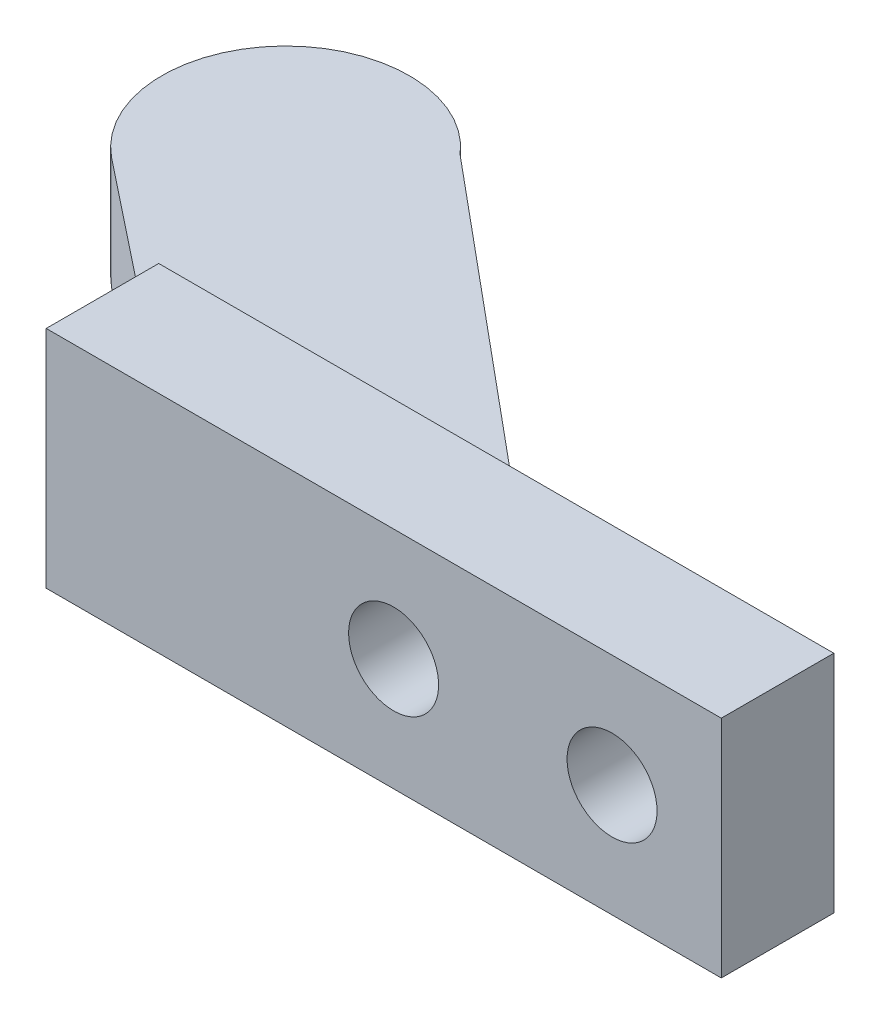
ISO-10303-21;
HEADER;
FILE_DESCRIPTION(('STEP AP214'),'2;1');
FILE_NAME('part.step','',(''),(''),'','','');
FILE_SCHEMA(('AUTOMOTIVE_DESIGN { 1 0 10303 214 1 1 1 1 }'));
ENDSEC;
DATA;
#1=APPLICATION_CONTEXT('core data for automotive mechanical design processes');
#2=APPLICATION_PROTOCOL_DEFINITION('international standard','automotive_design',2000,#1);
#3=PRODUCT_CONTEXT('',#1,'mechanical');
#4=PRODUCT('Part','Part','',(#3));
#5=PRODUCT_RELATED_PRODUCT_CATEGORY('part','',(#4));
#6=PRODUCT_DEFINITION_FORMATION('','',#4);
#7=PRODUCT_DEFINITION_CONTEXT('part definition',#1,'design');
#8=PRODUCT_DEFINITION('design','',#6,#7);
#9=PRODUCT_DEFINITION_SHAPE('','',#8);
#10=(LENGTH_UNIT() NAMED_UNIT(*) SI_UNIT(.MILLI.,.METRE.));
#11=(NAMED_UNIT(*) PLANE_ANGLE_UNIT() SI_UNIT($,.RADIAN.));
#12=(NAMED_UNIT(*) SI_UNIT($,.STERADIAN.) SOLID_ANGLE_UNIT());
#13=UNCERTAINTY_MEASURE_WITH_UNIT(LENGTH_MEASURE(1.E-05),#10,'distance_accuracy_value','');
#14=(GEOMETRIC_REPRESENTATION_CONTEXT(3) GLOBAL_UNCERTAINTY_ASSIGNED_CONTEXT((#13)) GLOBAL_UNIT_ASSIGNED_CONTEXT((#10,
#11,#12)) REPRESENTATION_CONTEXT('',''));
#15=CARTESIAN_POINT('',(0.,0.,0.));
#16=DIRECTION('',(0.,0.,1.));
#17=DIRECTION('',(1.,0.,0.));
#18=AXIS2_PLACEMENT_3D('',#15,#16,#17);
#19=CARTESIAN_POINT('',(21.8540407080777,5.,0.));
#20=DIRECTION('',(-1.,0.,0.));
#21=DIRECTION('',(0.,0.,1.));
#22=AXIS2_PLACEMENT_3D('',#19,#20,#21);
#23=PLANE('',#22);
#24=DIRECTION('',(0.,-1.,0.));
#25=VECTOR('',#24,1.);
#26=CARTESIAN_POINT('',(21.8540407080777,10.,19.9532567430728));
#27=LINE('',#26,#25);
#28=CARTESIAN_POINT('',(21.8540407080777,10.,19.9532567430728));
#29=VERTEX_POINT('',#28);
#30=CARTESIAN_POINT('',(21.8540407080777,0.,19.9532567430728));
#31=VERTEX_POINT('',#30);
#32=EDGE_CURVE('E118',#29,#31,#27,.T.);
#33=ORIENTED_EDGE('',*,*,#32,.F.);
#34=DIRECTION('',(0.,0.,-1.));
#35=VECTOR('',#34,1.);
#36=CARTESIAN_POINT('',(21.8540407080777,10.,14.9532567430728));
#37=LINE('',#36,#35);
#38=CARTESIAN_POINT('',(21.8540407080777,10.,24.9532567430728));
#39=VERTEX_POINT('',#38);
#40=EDGE_CURVE('E256',#39,#29,#37,.T.);
#41=ORIENTED_EDGE('',*,*,#40,.F.);
#42=DIRECTION('',(0.,1.,0.));
#43=VECTOR('',#42,1.);
#44=CARTESIAN_POINT('',(21.8540407080777,0.,24.9532567430728));
#45=LINE('',#44,#43);
#46=CARTESIAN_POINT('',(21.8540407080777,0.,24.9532567430728));
#47=VERTEX_POINT('',#46);
#48=EDGE_CURVE('E142',#47,#39,#45,.T.);
#49=ORIENTED_EDGE('',*,*,#48,.F.);
#50=DIRECTION('',(0.,0.,-1.));
#51=VECTOR('',#50,1.);
#52=CARTESIAN_POINT('',(21.8540407080777,0.,0.));
#53=LINE('',#52,#51);
#54=EDGE_CURVE('E135',#47,#31,#53,.T.);
#55=ORIENTED_EDGE('',*,*,#54,.T.);
#56=EDGE_LOOP('',(#33,#41,#49,#55));
#57=FACE_BOUND('',#56,.T.);
#58=ADVANCED_FACE('F47',(#57),#23,.F.);
#59=CARTESIAN_POINT('',(0.,10.,0.));
#60=DIRECTION('',(0.,-1.,0.));
#61=DIRECTION('',(0.,0.,-1.));
#62=AXIS2_PLACEMENT_3D('',#59,#60,#61);
#63=PLANE('',#62);
#64=DIRECTION('',(1.,0.,0.));
#65=VECTOR('',#64,1.);
#66=CARTESIAN_POINT('',(-14.452391165853,10.,19.9532567430728));
#67=LINE('',#66,#65);
#68=CARTESIAN_POINT('',(-8.14595929192235,10.,19.9532567430728));
#69=VERTEX_POINT('',#68);
#70=EDGE_CURVE('E125',#69,#29,#67,.T.);
#71=ORIENTED_EDGE('',*,*,#70,.F.);
#72=DIRECTION('',(0.,0.,1.));
#73=VECTOR('',#72,1.);
#74=CARTESIAN_POINT('',(-8.14595929192235,10.,0.));
#75=LINE('',#74,#73);
#76=CARTESIAN_POINT('',(-8.14595929192235,10.,24.9532567430728));
#77=VERTEX_POINT('',#76);
#78=EDGE_CURVE('E235',#69,#77,#75,.T.);
#79=ORIENTED_EDGE('',*,*,#78,.T.);
#80=DIRECTION('',(1.,0.,0.));
#81=VECTOR('',#80,1.);
#82=CARTESIAN_POINT('',(0.,10.,24.9532567430728));
#83=LINE('',#82,#81);
#84=EDGE_CURVE('E244',#77,#39,#83,.T.);
#85=ORIENTED_EDGE('',*,*,#84,.T.);
#86=ORIENTED_EDGE('',*,*,#40,.T.);
#87=EDGE_LOOP('',(#71,#79,#85,#86));
#88=FACE_BOUND('',#87,.T.);
#89=ADVANCED_FACE('F278',(#88),#63,.F.);
#90=CARTESIAN_POINT('',(16.9998841256251,5.,24.9532567430728));
#91=DIRECTION('',(0.,0.,-1.));
#92=DIRECTION('',(-1.,0.,0.));
#93=AXIS2_PLACEMENT_3D('',#90,#91,#92);
#94=CYLINDRICAL_SURFACE('',#93,2.);
#95=CARTESIAN_POINT('',(16.9998841256251,5.,24.9532567430728));
#96=DIRECTION('',(0.,0.,1.));
#97=DIRECTION('',(1.,0.,0.));
#98=AXIS2_PLACEMENT_3D('',#95,#96,#97);
#99=CIRCLE('',#98,2.);
#100=CARTESIAN_POINT('',(18.9998841256251,5.,24.9532567430728));
#101=VERTEX_POINT('',#100);
#102=EDGE_CURVE('E230',#101,#101,#99,.T.);
#103=ORIENTED_EDGE('',*,*,#102,.T.);
#104=EDGE_LOOP('',(#103));
#105=FACE_BOUND('',#104,.T.);
#106=CARTESIAN_POINT('',(16.9998841256251,5.,19.9532567430728));
#107=DIRECTION('',(0.,0.,-1.));
#108=DIRECTION('',(-1.,0.,0.));
#109=AXIS2_PLACEMENT_3D('',#106,#107,#108);
#110=CIRCLE('',#109,2.);
#111=CARTESIAN_POINT('',(14.9998841256251,5.,19.9532567430728));
#112=VERTEX_POINT('',#111);
#113=EDGE_CURVE('E197',#112,#112,#110,.T.);
#114=ORIENTED_EDGE('',*,*,#113,.T.);
#115=EDGE_LOOP('',(#114));
#116=FACE_BOUND('',#115,.T.);
#117=ADVANCED_FACE('F293',(#105,#116),#94,.F.);
#118=CARTESIAN_POINT('',(7.29157096072009,5.,24.9532567430728));
#119=DIRECTION('',(0.,0.,-1.));
#120=DIRECTION('',(-1.,0.,0.));
#121=AXIS2_PLACEMENT_3D('',#118,#119,#120);
#122=CYLINDRICAL_SURFACE('',#121,2.);
#123=CARTESIAN_POINT('',(7.29157096072009,5.,24.9532567430728));
#124=DIRECTION('',(0.,0.,-1.));
#125=DIRECTION('',(-1.,0.,0.));
#126=AXIS2_PLACEMENT_3D('',#123,#124,#125);
#127=CIRCLE('',#126,2.);
#128=CARTESIAN_POINT('',(5.29157096072009,5.,24.9532567430728));
#129=VERTEX_POINT('',#128);
#130=EDGE_CURVE('E231',#129,#129,#127,.T.);
#131=ORIENTED_EDGE('',*,*,#130,.F.);
#132=EDGE_LOOP('',(#131));
#133=FACE_BOUND('',#132,.T.);
#134=CARTESIAN_POINT('',(7.29157096072009,5.,19.9532567430728));
#135=DIRECTION('',(0.,0.,-1.));
#136=DIRECTION('',(-1.,0.,0.));
#137=AXIS2_PLACEMENT_3D('',#134,#135,#136);
#138=CIRCLE('',#137,2.);
#139=CARTESIAN_POINT('',(5.29157096072009,5.,19.9532567430728));
#140=VERTEX_POINT('',#139);
#141=EDGE_CURVE('E193',#140,#140,#138,.F.);
#142=ORIENTED_EDGE('',*,*,#141,.F.);
#143=EDGE_LOOP('',(#142));
#144=FACE_BOUND('',#143,.T.);
#145=ADVANCED_FACE('F286',(#133,#144),#122,.F.);
#146=CARTESIAN_POINT('',(0.,0.,24.9532567430728));
#147=DIRECTION('',(0.,0.,1.));
#148=DIRECTION('',(1.,0.,0.));
#149=AXIS2_PLACEMENT_3D('',#146,#147,#148);
#150=PLANE('',#149);
#151=ORIENTED_EDGE('',*,*,#102,.F.);
#152=EDGE_LOOP('',(#151));
#153=FACE_BOUND('',#152,.T.);
#154=ORIENTED_EDGE('',*,*,#84,.F.);
#155=DIRECTION('',(0.,1.,0.));
#156=VECTOR('',#155,1.);
#157=CARTESIAN_POINT('',(-8.14595929192235,0.,24.9532567430728));
#158=LINE('',#157,#156);
#159=CARTESIAN_POINT('',(-8.14595929192235,0.,24.9532567430728));
#160=VERTEX_POINT('',#159);
#161=EDGE_CURVE('E247',#160,#77,#158,.T.);
#162=ORIENTED_EDGE('',*,*,#161,.F.);
#163=DIRECTION('',(1.,0.,0.));
#164=VECTOR('',#163,1.);
#165=CARTESIAN_POINT('',(0.,0.,24.9532567430728));
#166=LINE('',#165,#164);
#167=EDGE_CURVE('E243',#160,#47,#166,.T.);
#168=ORIENTED_EDGE('',*,*,#167,.T.);
#169=ORIENTED_EDGE('',*,*,#48,.T.);
#170=EDGE_LOOP('',(#154,#162,#168,#169));
#171=FACE_BOUND('',#170,.T.);
#172=ORIENTED_EDGE('',*,*,#130,.T.);
#173=EDGE_LOOP('',(#172));
#174=FACE_BOUND('',#173,.T.);
#175=ADVANCED_FACE('F282',(#153,#171,#174),#150,.T.);
#176=CARTESIAN_POINT('',(-6.35496567806132,5.,7.63378536190709));
#177=DIRECTION('',(-0.639796801410756,0.,0.768544112530026));
#178=DIRECTION('',(0.768544112530026,0.,0.639796801410756));
#179=AXIS2_PLACEMENT_3D('',#176,#177,#178);
#180=PLANE('',#179);
#181=DIRECTION('',(-0.768544112530026,0.,-0.639796801410756));
#182=VECTOR('',#181,1.);
#183=CARTESIAN_POINT('',(-6.35496567806132,0.,7.63378536190709));
#184=LINE('',#183,#182);
#185=CARTESIAN_POINT('',(2.43741437826756,0.,14.9532567430728));
#186=VERTEX_POINT('',#185);
#187=CARTESIAN_POINT('',(-10.632140567897,0.,4.07312726957885));
#188=VERTEX_POINT('',#187);
#189=EDGE_CURVE('E260',#186,#188,#184,.T.);
#190=ORIENTED_EDGE('',*,*,#189,.T.);
#191=DIRECTION('',(0.,-1.,0.));
#192=VECTOR('',#191,1.);
#193=CARTESIAN_POINT('',(-10.632140567897,5.,4.07312726957885));
#194=LINE('',#193,#192);
#195=CARTESIAN_POINT('',(-10.632140567897,5.,4.07312726957885));
#196=VERTEX_POINT('',#195);
#197=EDGE_CURVE('E172',#196,#188,#194,.T.);
#198=ORIENTED_EDGE('',*,*,#197,.F.);
#199=DIRECTION('',(-0.768544112530026,0.,-0.639796801410756));
#200=VECTOR('',#199,1.);
#201=CARTESIAN_POINT('',(-6.35496567806132,5.,7.63378536190709));
#202=LINE('',#201,#200);
#203=CARTESIAN_POINT('',(2.43741437826756,5.,14.9532567430728));
#204=VERTEX_POINT('',#203);
#205=EDGE_CURVE('E145',#204,#196,#202,.T.);
#206=ORIENTED_EDGE('',*,*,#205,.F.);
#207=DIRECTION('',(0.,-1.,0.));
#208=VECTOR('',#207,1.);
#209=CARTESIAN_POINT('',(2.43741437826756,5.,14.9532567430728));
#210=LINE('',#209,#208);
#211=EDGE_CURVE('E158',#204,#186,#210,.T.);
#212=ORIENTED_EDGE('',*,*,#211,.T.);
#213=EDGE_LOOP('',(#190,#198,#206,#212));
#214=FACE_BOUND('',#213,.T.);
#215=ADVANCED_FACE('F285',(#214),#180,.F.);
#216=CARTESIAN_POINT('',(-14.807385824528,5.,7.65325674307282));
#217=DIRECTION('',(0.,-1.,0.));
#218=DIRECTION('',(0.,0.,-1.));
#219=AXIS2_PLACEMENT_3D('',#216,#217,#218);
#220=CYLINDRICAL_SURFACE('',#219,5.5);
#221=CARTESIAN_POINT('',(-14.807385824528,0.,7.65325674307282));
#222=DIRECTION('',(0.,1.,0.));
#223=DIRECTION('',(0.,0.,1.));
#224=AXIS2_PLACEMENT_3D('',#221,#222,#223);
#225=CIRCLE('',#224,5.5);
#226=CARTESIAN_POINT('',(-18.2679945911423,0.,11.9280885484697));
#227=VERTEX_POINT('',#226);
#228=EDGE_CURVE('E154',#188,#227,#225,.T.);
#229=ORIENTED_EDGE('',*,*,#228,.T.);
#230=DIRECTION('',(0.,-1.,0.));
#231=VECTOR('',#230,1.);
#232=CARTESIAN_POINT('',(-18.2679945911423,5.,11.9280885484697));
#233=LINE('',#232,#231);
#234=CARTESIAN_POINT('',(-18.2679945911423,5.,11.9280885484697));
#235=VERTEX_POINT('',#234);
#236=EDGE_CURVE('E168',#235,#227,#233,.T.);
#237=ORIENTED_EDGE('',*,*,#236,.F.);
#238=CARTESIAN_POINT('',(-14.807385824528,5.,7.65325674307282));
#239=DIRECTION('',(0.,1.,0.));
#240=DIRECTION('',(0.,0.,1.));
#241=AXIS2_PLACEMENT_3D('',#238,#239,#240);
#242=CIRCLE('',#241,5.5);
#243=EDGE_CURVE('E151',#196,#235,#242,.T.);
#244=ORIENTED_EDGE('',*,*,#243,.F.);
#245=ORIENTED_EDGE('',*,*,#197,.T.);
#246=EDGE_LOOP('',(#229,#237,#244,#245));
#247=FACE_BOUND('',#246,.T.);
#248=ADVANCED_FACE('F268',(#247),#220,.T.);
#249=CARTESIAN_POINT('',(-12.8578713762529,5.,16.2174579756204));
#250=DIRECTION('',(0.621268629874655,0.,-0.783597657942945));
#251=DIRECTION('',(-0.783597657942945,0.,-0.621268629874655));
#252=AXIS2_PLACEMENT_3D('',#249,#250,#251);
#253=PLANE('',#252);
#254=DIRECTION('',(0.,-1.,0.));
#255=VECTOR('',#254,1.);
#256=CARTESIAN_POINT('',(-8.14595929192235,5.,19.9532567430728));
#257=LINE('',#256,#255);
#258=CARTESIAN_POINT('',(-8.14595929192235,7.,19.9532567430728));
#259=VERTEX_POINT('',#258);
#260=CARTESIAN_POINT('',(-8.14595929192235,0.,19.9532567430728));
#261=VERTEX_POINT('',#260);
#262=EDGE_CURVE('E162',#259,#261,#257,.T.);
#263=ORIENTED_EDGE('',*,*,#262,.F.);
#264=CARTESIAN_POINT('',(-10.6685320414946,7.,17.9532567430728));
#265=DIRECTION('',(0.621268629874655,0.,-0.783597657942945));
#266=DIRECTION('',(0.783597657942945,0.,0.621268629874655));
#267=AXIS2_PLACEMENT_3D('',#264,#265,#266);
#268=ELLIPSE('',#267,3.21921935830482,2.);
#269=CARTESIAN_POINT('',(-10.6685320414946,5.,17.9532567430728));
#270=VERTEX_POINT('',#269);
#271=EDGE_CURVE('E57',#259,#270,#268,.T.);
#272=ORIENTED_EDGE('',*,*,#271,.T.);
#273=DIRECTION('',(0.783597657942946,0.,0.621268629874655));
#274=VECTOR('',#273,1.);
#275=CARTESIAN_POINT('',(-12.8578713762529,5.,16.2174579756204));
#276=LINE('',#275,#274);
#277=EDGE_CURVE('E163',#235,#270,#276,.T.);
#278=ORIENTED_EDGE('',*,*,#277,.F.);
#279=ORIENTED_EDGE('',*,*,#236,.T.);
#280=DIRECTION('',(0.783597657942946,0.,0.621268629874655));
#281=VECTOR('',#280,1.);
#282=CARTESIAN_POINT('',(-12.8578713762529,0.,16.2174579756204));
#283=LINE('',#282,#281);
#284=EDGE_CURVE('E146',#227,#261,#283,.T.);
#285=ORIENTED_EDGE('',*,*,#284,.T.);
#286=EDGE_LOOP('',(#263,#272,#278,#279,#285));
#287=FACE_BOUND('',#286,.T.);
#288=ADVANCED_FACE('F208',(#287),#253,.F.);
#289=CARTESIAN_POINT('',(0.,5.,0.));
#290=DIRECTION('',(0.,1.,0.));
#291=DIRECTION('',(0.,0.,1.));
#292=AXIS2_PLACEMENT_3D('',#289,#290,#291);
#293=PLANE('',#292);
#294=ORIENTED_EDGE('',*,*,#277,.T.);
#295=DIRECTION('',(-1.,0.,0.));
#296=VECTOR('',#295,1.);
#297=CARTESIAN_POINT('',(2.43741437826756,5.,17.9532567430728));
#298=LINE('',#297,#296);
#299=CARTESIAN_POINT('',(2.43741437826756,5.,17.9532567430728));
#300=VERTEX_POINT('',#299);
#301=EDGE_CURVE('E64',#270,#300,#298,.F.);
#302=ORIENTED_EDGE('',*,*,#301,.T.);
#303=DIRECTION('',(0.,0.,-1.));
#304=VECTOR('',#303,1.);
#305=CARTESIAN_POINT('',(2.43741437826756,5.,19.9532567430728));
#306=LINE('',#305,#304);
#307=EDGE_CURVE('E198',#300,#204,#306,.T.);
#308=ORIENTED_EDGE('',*,*,#307,.T.);
#309=ORIENTED_EDGE('',*,*,#205,.T.);
#310=ORIENTED_EDGE('',*,*,#243,.T.);
#311=EDGE_LOOP('',(#294,#302,#308,#309,#310));
#312=FACE_BOUND('',#311,.T.);
#313=ADVANCED_FACE('F211',(#312),#293,.T.);
#314=CARTESIAN_POINT('',(0.,0.,0.));
#315=DIRECTION('',(0.,1.,0.));
#316=DIRECTION('',(0.,0.,1.));
#317=AXIS2_PLACEMENT_3D('',#314,#315,#316);
#318=PLANE('',#317);
#319=CARTESIAN_POINT('',(-14.807385824528,0.,7.65325674307282));
#320=DIRECTION('',(0.,1.,0.));
#321=DIRECTION('',(0.,0.,1.));
#322=AXIS2_PLACEMENT_3D('',#319,#320,#321);
#323=CIRCLE('',#322,3.6);
#324=CARTESIAN_POINT('',(-14.807385824528,0.,11.2532567430728));
#325=VERTEX_POINT('',#324);
#326=EDGE_CURVE('E184',#325,#325,#323,.T.);
#327=ORIENTED_EDGE('',*,*,#326,.T.);
#328=EDGE_LOOP('',(#327));
#329=FACE_BOUND('',#328,.T.);
#330=ORIENTED_EDGE('',*,*,#189,.F.);
#331=DIRECTION('',(0.,0.,-1.));
#332=VECTOR('',#331,1.);
#333=CARTESIAN_POINT('',(2.43741437826756,0.,19.9532567430728));
#334=LINE('',#333,#332);
#335=CARTESIAN_POINT('',(2.43741437826756,0.,19.9532567430728));
#336=VERTEX_POINT('',#335);
#337=EDGE_CURVE('E137',#336,#186,#334,.T.);
#338=ORIENTED_EDGE('',*,*,#337,.F.);
#339=DIRECTION('',(-1.,0.,0.));
#340=VECTOR('',#339,1.);
#341=CARTESIAN_POINT('',(21.8540407080777,0.,19.9532567430728));
#342=LINE('',#341,#340);
#343=EDGE_CURVE('E122',#31,#336,#342,.T.);
#344=ORIENTED_EDGE('',*,*,#343,.F.);
#345=ORIENTED_EDGE('',*,*,#54,.F.);
#346=ORIENTED_EDGE('',*,*,#167,.F.);
#347=DIRECTION('',(0.,0.,1.));
#348=VECTOR('',#347,1.);
#349=CARTESIAN_POINT('',(-8.14595929192235,0.,0.));
#350=LINE('',#349,#348);
#351=EDGE_CURVE('E239',#261,#160,#350,.T.);
#352=ORIENTED_EDGE('',*,*,#351,.F.);
#353=ORIENTED_EDGE('',*,*,#284,.F.);
#354=ORIENTED_EDGE('',*,*,#228,.F.);
#355=EDGE_LOOP('',(#330,#338,#344,#345,#346,#352,#353,#354));
#356=FACE_BOUND('',#355,.T.);
#357=ADVANCED_FACE('F133',(#329,#356),#318,.F.);
#358=CARTESIAN_POINT('',(-14.807385824528,-5.,7.65325674307282));
#359=DIRECTION('',(0.,1.,0.));
#360=DIRECTION('',(0.,0.,1.));
#361=AXIS2_PLACEMENT_3D('',#358,#359,#360);
#362=CYLINDRICAL_SURFACE('',#361,2.6);
#363=CARTESIAN_POINT('',(-14.807385824528,-1.,7.65325674307282));
#364=DIRECTION('',(0.,1.,0.));
#365=DIRECTION('',(0.,0.,1.));
#366=AXIS2_PLACEMENT_3D('',#363,#364,#365);
#367=CIRCLE('',#366,2.6);
#368=CARTESIAN_POINT('',(-14.807385824528,-1.,10.2532567430728));
#369=VERTEX_POINT('',#368);
#370=EDGE_CURVE('E188',#369,#369,#367,.F.);
#371=ORIENTED_EDGE('',*,*,#370,.T.);
#372=EDGE_LOOP('',(#371));
#373=FACE_BOUND('',#372,.T.);
#374=CARTESIAN_POINT('',(-14.807385824528,-4.5,7.65325674307282));
#375=DIRECTION('',(0.,1.,0.));
#376=DIRECTION('',(0.,0.,1.));
#377=AXIS2_PLACEMENT_3D('',#374,#375,#376);
#378=CIRCLE('',#377,2.6);
#379=CARTESIAN_POINT('',(-14.807385824528,-4.5,10.2532567430728));
#380=VERTEX_POINT('',#379);
#381=EDGE_CURVE('E176',#380,#380,#378,.T.);
#382=ORIENTED_EDGE('',*,*,#381,.T.);
#383=EDGE_LOOP('',(#382));
#384=FACE_BOUND('',#383,.T.);
#385=ADVANCED_FACE('F339',(#373,#384),#362,.T.);
#386=CARTESIAN_POINT('',(0.,-5.,0.));
#387=DIRECTION('',(0.,1.,0.));
#388=DIRECTION('',(0.,0.,1.));
#389=AXIS2_PLACEMENT_3D('',#386,#387,#388);
#390=PLANE('',#389);
#391=CARTESIAN_POINT('',(-14.807385824528,-5.,7.65325674307282));
#392=DIRECTION('',(0.,1.,0.));
#393=DIRECTION('',(0.,0.,1.));
#394=AXIS2_PLACEMENT_3D('',#391,#392,#393);
#395=CIRCLE('',#394,2.09999999999999);
#396=CARTESIAN_POINT('',(-14.807385824528,-5.,9.75325674307281));
#397=VERTEX_POINT('',#396);
#398=EDGE_CURVE('E180',#397,#397,#395,.F.);
#399=ORIENTED_EDGE('',*,*,#398,.T.);
#400=EDGE_LOOP('',(#399));
#401=FACE_BOUND('',#400,.T.);
#402=ADVANCED_FACE('F328',(#401),#390,.F.);
#403=CARTESIAN_POINT('',(-14.807385824528,-4.5,7.65325674307282));
#404=DIRECTION('',(0.,1.,0.));
#405=DIRECTION('',(0.,0.,1.));
#406=AXIS2_PLACEMENT_3D('',#403,#404,#405);
#407=CONICAL_SURFACE('',#406,2.6,0.785398163397451);
#408=ORIENTED_EDGE('',*,*,#398,.F.);
#409=EDGE_LOOP('',(#408));
#410=FACE_BOUND('',#409,.T.);
#411=ORIENTED_EDGE('',*,*,#381,.F.);
#412=EDGE_LOOP('',(#411));
#413=FACE_BOUND('',#412,.T.);
#414=ADVANCED_FACE('F324',(#410,#413),#407,.T.);
#415=CARTESIAN_POINT('',(-14.807385824528,-1.,7.65325674307282));
#416=DIRECTION('',(0.,1.,0.));
#417=DIRECTION('',(0.,0.,1.));
#418=AXIS2_PLACEMENT_3D('',#415,#416,#417);
#419=TOROIDAL_SURFACE('',#418,3.6,1.);
#420=ORIENTED_EDGE('',*,*,#370,.F.);
#421=EDGE_LOOP('',(#420));
#422=FACE_BOUND('',#421,.T.);
#423=ORIENTED_EDGE('',*,*,#326,.F.);
#424=EDGE_LOOP('',(#423));
#425=FACE_BOUND('',#424,.T.);
#426=ADVANCED_FACE('F304',(#422,#425),#419,.F.);
#427=CARTESIAN_POINT('',(-8.14595929192235,0.,0.));
#428=DIRECTION('',(-1.,0.,0.));
#429=DIRECTION('',(0.,0.,1.));
#430=AXIS2_PLACEMENT_3D('',#427,#428,#429);
#431=PLANE('',#430);
#432=ORIENTED_EDGE('',*,*,#78,.F.);
#433=EDGE_CURVE('E164',#69,#259,#257,.T.);
#434=ORIENTED_EDGE('',*,*,#433,.T.);
#435=ORIENTED_EDGE('',*,*,#262,.T.);
#436=ORIENTED_EDGE('',*,*,#351,.T.);
#437=ORIENTED_EDGE('',*,*,#161,.T.);
#438=EDGE_LOOP('',(#432,#434,#435,#436,#437));
#439=FACE_BOUND('',#438,.T.);
#440=ADVANCED_FACE('F274',(#439),#431,.T.);
#441=CARTESIAN_POINT('',(0.,0.,19.9532567430728));
#442=DIRECTION('',(0.,0.,-1.));
#443=DIRECTION('',(-1.,0.,0.));
#444=AXIS2_PLACEMENT_3D('',#441,#442,#443);
#445=PLANE('',#444);
#446=ORIENTED_EDGE('',*,*,#113,.F.);
#447=EDGE_LOOP('',(#446));
#448=FACE_BOUND('',#447,.T.);
#449=DIRECTION('',(0.,1.,0.));
#450=VECTOR('',#449,1.);
#451=CARTESIAN_POINT('',(2.43741437826756,0.,19.9532567430728));
#452=LINE('',#451,#450);
#453=CARTESIAN_POINT('',(2.43741437826756,7.,19.9532567430728));
#454=VERTEX_POINT('',#453);
#455=EDGE_CURVE('E139',#336,#454,#452,.T.);
#456=ORIENTED_EDGE('',*,*,#455,.T.);
#457=DIRECTION('',(-1.,0.,0.));
#458=VECTOR('',#457,1.);
#459=CARTESIAN_POINT('',(-8.14595929192235,7.,19.9532567430728));
#460=LINE('',#459,#458);
#461=EDGE_CURVE('E192',#454,#259,#460,.T.);
#462=ORIENTED_EDGE('',*,*,#461,.T.);
#463=ORIENTED_EDGE('',*,*,#433,.F.);
#464=ORIENTED_EDGE('',*,*,#70,.T.);
#465=ORIENTED_EDGE('',*,*,#32,.T.);
#466=ORIENTED_EDGE('',*,*,#343,.T.);
#467=EDGE_LOOP('',(#456,#462,#463,#464,#465,#466));
#468=FACE_BOUND('',#467,.T.);
#469=ORIENTED_EDGE('',*,*,#141,.T.);
#470=EDGE_LOOP('',(#469));
#471=FACE_BOUND('',#470,.T.);
#472=ADVANCED_FACE('F120',(#448,#468,#471),#445,.T.);
#473=CARTESIAN_POINT('',(2.43741437826756,0.,19.9532567430728));
#474=DIRECTION('',(-1.,0.,0.));
#475=DIRECTION('',(0.,0.,1.));
#476=AXIS2_PLACEMENT_3D('',#473,#474,#475);
#477=PLANE('',#476);
#478=ORIENTED_EDGE('',*,*,#211,.F.);
#479=ORIENTED_EDGE('',*,*,#307,.F.);
#480=CARTESIAN_POINT('',(2.43741437826756,7.,17.9532567430728));
#481=DIRECTION('',(-1.,0.,0.));
#482=DIRECTION('',(0.,0.,1.));
#483=AXIS2_PLACEMENT_3D('',#480,#481,#482);
#484=CIRCLE('',#483,2.);
#485=EDGE_CURVE('E11',#300,#454,#484,.T.);
#486=ORIENTED_EDGE('',*,*,#485,.T.);
#487=ORIENTED_EDGE('',*,*,#455,.F.);
#488=ORIENTED_EDGE('',*,*,#337,.T.);
#489=EDGE_LOOP('',(#478,#479,#486,#487,#488));
#490=FACE_BOUND('',#489,.T.);
#491=ADVANCED_FACE('F218',(#490),#477,.F.);
#492=CARTESIAN_POINT('',(0.,7.,17.9532567430728));
#493=DIRECTION('',(1.,0.,0.));
#494=DIRECTION('',(0.,0.,-1.));
#495=AXIS2_PLACEMENT_3D('',#492,#493,#494);
#496=CYLINDRICAL_SURFACE('',#495,2.);
#497=ORIENTED_EDGE('',*,*,#485,.F.);
#498=ORIENTED_EDGE('',*,*,#301,.F.);
#499=ORIENTED_EDGE('',*,*,#271,.F.);
#500=ORIENTED_EDGE('',*,*,#461,.F.);
#501=EDGE_LOOP('',(#497,#498,#499,#500));
#502=FACE_BOUND('',#501,.T.);
#503=ADVANCED_FACE('F49',(#502),#496,.F.);
#504=CLOSED_SHELL('',(#58,#89,#117,#145,#175,#215,#248,#288,#313,#357,#385,#402,#414,#426,#440,
#472,#491,#503));
#505=MANIFOLD_SOLID_BREP('B2',#504);
#506=ADVANCED_BREP_SHAPE_REPRESENTATION('',(#18,#505),#14);
#507=SHAPE_DEFINITION_REPRESENTATION(#9,#506);
ENDSEC;
END-ISO-10303-21;
